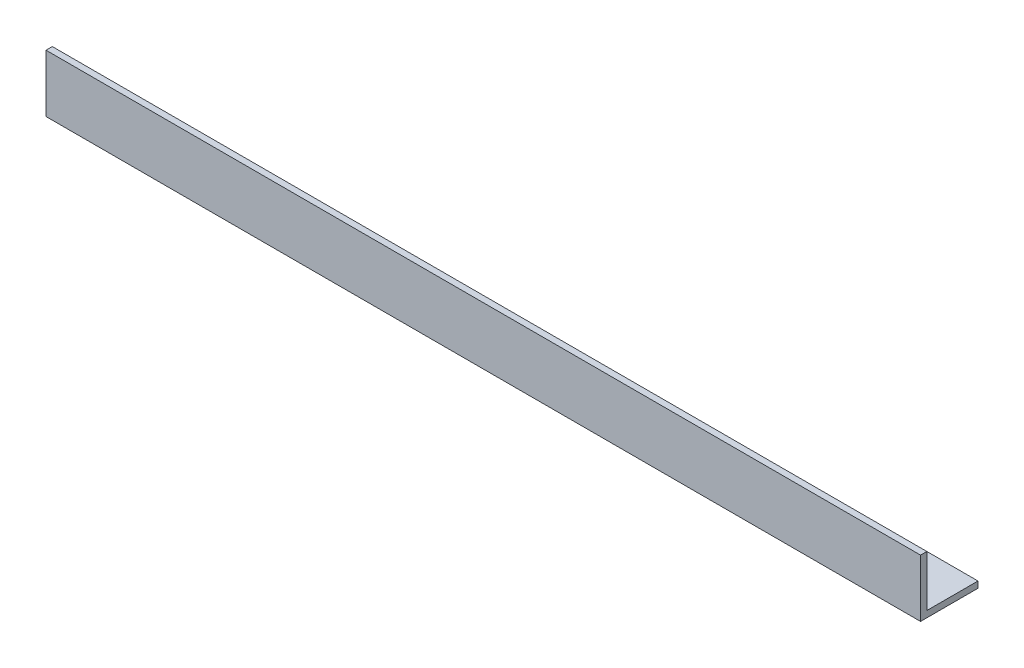
ISO-10303-21;
HEADER;
FILE_DESCRIPTION(('STEP AP214'),'2;1');
FILE_NAME('part.step','',(''),(''),'','','');
FILE_SCHEMA(('AUTOMOTIVE_DESIGN { 1 0 10303 214 1 1 1 1 }'));
ENDSEC;
DATA;
#1=APPLICATION_CONTEXT('core data for automotive mechanical design processes');
#2=APPLICATION_PROTOCOL_DEFINITION('international standard','automotive_design',2000,#1);
#3=PRODUCT_CONTEXT('',#1,'mechanical');
#4=PRODUCT('Part','Part','',(#3));
#5=PRODUCT_RELATED_PRODUCT_CATEGORY('part','',(#4));
#6=PRODUCT_DEFINITION_FORMATION('','',#4);
#7=PRODUCT_DEFINITION_CONTEXT('part definition',#1,'design');
#8=PRODUCT_DEFINITION('design','',#6,#7);
#9=PRODUCT_DEFINITION_SHAPE('','',#8);
#10=(LENGTH_UNIT() NAMED_UNIT(*) SI_UNIT(.MILLI.,.METRE.));
#11=(NAMED_UNIT(*) PLANE_ANGLE_UNIT() SI_UNIT($,.RADIAN.));
#12=(NAMED_UNIT(*) SI_UNIT($,.STERADIAN.) SOLID_ANGLE_UNIT());
#13=UNCERTAINTY_MEASURE_WITH_UNIT(LENGTH_MEASURE(1.E-05),#10,'distance_accuracy_value','');
#14=(GEOMETRIC_REPRESENTATION_CONTEXT(3) GLOBAL_UNCERTAINTY_ASSIGNED_CONTEXT((#13)) GLOBAL_UNIT_ASSIGNED_CONTEXT((#10,
#11,#12)) REPRESENTATION_CONTEXT('',''));
#15=CARTESIAN_POINT('',(0.,0.,0.));
#16=DIRECTION('',(0.,0.,1.));
#17=DIRECTION('',(1.,0.,0.));
#18=AXIS2_PLACEMENT_3D('',#15,#16,#17);
#19=CARTESIAN_POINT('',(193.294,2.794,0.));
#20=DIRECTION('',(1.,0.,0.));
#21=DIRECTION('',(0.,0.,-1.));
#22=AXIS2_PLACEMENT_3D('',#19,#20,#21);
#23=PLANE('',#22);
#24=DIRECTION('',(0.,0.,1.));
#25=VECTOR('',#24,1.);
#26=CARTESIAN_POINT('',(193.294,0.,0.));
#27=LINE('',#26,#25);
#28=CARTESIAN_POINT('',(193.294,0.,-12.7));
#29=VERTEX_POINT('',#28);
#30=CARTESIAN_POINT('',(193.294,0.,12.7));
#31=VERTEX_POINT('',#30);
#32=EDGE_CURVE('E78',#29,#31,#27,.T.);
#33=ORIENTED_EDGE('',*,*,#32,.F.);
#34=DIRECTION('',(0.,-1.,0.));
#35=VECTOR('',#34,1.);
#36=CARTESIAN_POINT('',(193.294,2.794,-12.7));
#37=LINE('',#36,#35);
#38=CARTESIAN_POINT('',(193.294,2.794,-12.7));
#39=VERTEX_POINT('',#38);
#40=EDGE_CURVE('E11',#39,#29,#37,.T.);
#41=ORIENTED_EDGE('',*,*,#40,.F.);
#42=DIRECTION('',(0.,0.,1.));
#43=VECTOR('',#42,1.);
#44=CARTESIAN_POINT('',(193.294,2.794,0.));
#45=LINE('',#44,#43);
#46=CARTESIAN_POINT('',(193.294,2.794,9.906));
#47=VERTEX_POINT('',#46);
#48=EDGE_CURVE('E97',#39,#47,#45,.T.);
#49=ORIENTED_EDGE('',*,*,#48,.T.);
#50=DIRECTION('',(0.,-1.,0.));
#51=VECTOR('',#50,1.);
#52=CARTESIAN_POINT('',(193.294,25.4,9.906));
#53=LINE('',#52,#51);
#54=CARTESIAN_POINT('',(193.294,25.4,9.906));
#55=VERTEX_POINT('',#54);
#56=EDGE_CURVE('E102',#55,#47,#53,.T.);
#57=ORIENTED_EDGE('',*,*,#56,.F.);
#58=DIRECTION('',(0.,0.,-1.));
#59=VECTOR('',#58,1.);
#60=CARTESIAN_POINT('',(193.294,25.4,12.7));
#61=LINE('',#60,#59);
#62=CARTESIAN_POINT('',(193.294,25.4,12.7));
#63=VERTEX_POINT('',#62);
#64=EDGE_CURVE('E83',#63,#55,#61,.T.);
#65=ORIENTED_EDGE('',*,*,#64,.F.);
#66=DIRECTION('',(0.,-1.,0.));
#67=VECTOR('',#66,1.);
#68=CARTESIAN_POINT('',(193.294,2.794,12.7));
#69=LINE('',#68,#67);
#70=EDGE_CURVE('E75',#63,#31,#69,.T.);
#71=ORIENTED_EDGE('',*,*,#70,.T.);
#72=EDGE_LOOP('',(#33,#41,#49,#57,#65,#71));
#73=FACE_BOUND('',#72,.T.);
#74=ADVANCED_FACE('F34',(#73),#23,.T.);
#75=CARTESIAN_POINT('',(0.,2.794,-12.7));
#76=DIRECTION('',(0.,0.,-1.));
#77=DIRECTION('',(-1.,0.,0.));
#78=AXIS2_PLACEMENT_3D('',#75,#76,#77);
#79=PLANE('',#78);
#80=DIRECTION('',(1.,0.,0.));
#81=VECTOR('',#80,1.);
#82=CARTESIAN_POINT('',(0.,0.,-12.7));
#83=LINE('',#82,#81);
#84=CARTESIAN_POINT('',(-193.294,0.,-12.7));
#85=VERTEX_POINT('',#84);
#86=EDGE_CURVE('E101',#85,#29,#83,.T.);
#87=ORIENTED_EDGE('',*,*,#86,.F.);
#88=DIRECTION('',(0.,-1.,0.));
#89=VECTOR('',#88,1.);
#90=CARTESIAN_POINT('',(-193.294,2.794,-12.7));
#91=LINE('',#90,#89);
#92=CARTESIAN_POINT('',(-193.294,2.794,-12.7));
#93=VERTEX_POINT('',#92);
#94=EDGE_CURVE('E41',#93,#85,#91,.T.);
#95=ORIENTED_EDGE('',*,*,#94,.F.);
#96=DIRECTION('',(1.,0.,0.));
#97=VECTOR('',#96,1.);
#98=CARTESIAN_POINT('',(0.,2.794,-12.7));
#99=LINE('',#98,#97);
#100=EDGE_CURVE('E117',#93,#39,#99,.T.);
#101=ORIENTED_EDGE('',*,*,#100,.T.);
#102=ORIENTED_EDGE('',*,*,#40,.T.);
#103=EDGE_LOOP('',(#87,#95,#101,#102));
#104=FACE_BOUND('',#103,.T.);
#105=ADVANCED_FACE('F116',(#104),#79,.T.);
#106=CARTESIAN_POINT('',(-193.294,2.794,0.));
#107=DIRECTION('',(1.,0.,0.));
#108=DIRECTION('',(0.,0.,-1.));
#109=AXIS2_PLACEMENT_3D('',#106,#107,#108);
#110=PLANE('',#109);
#111=DIRECTION('',(0.,0.,1.));
#112=VECTOR('',#111,1.);
#113=CARTESIAN_POINT('',(-193.294,0.,0.));
#114=LINE('',#113,#112);
#115=CARTESIAN_POINT('',(-193.294,0.,12.7));
#116=VERTEX_POINT('',#115);
#117=EDGE_CURVE('E98',#85,#116,#114,.T.);
#118=ORIENTED_EDGE('',*,*,#117,.T.);
#119=DIRECTION('',(0.,-1.,0.));
#120=VECTOR('',#119,1.);
#121=CARTESIAN_POINT('',(-193.294,2.794,12.7));
#122=LINE('',#121,#120);
#123=CARTESIAN_POINT('',(-193.294,25.4,12.7));
#124=VERTEX_POINT('',#123);
#125=EDGE_CURVE('E87',#124,#116,#122,.T.);
#126=ORIENTED_EDGE('',*,*,#125,.F.);
#127=DIRECTION('',(0.,0.,1.));
#128=VECTOR('',#127,1.);
#129=CARTESIAN_POINT('',(-193.294,25.4,12.7));
#130=LINE('',#129,#128);
#131=CARTESIAN_POINT('',(-193.294,25.4,9.906));
#132=VERTEX_POINT('',#131);
#133=EDGE_CURVE('E124',#132,#124,#130,.T.);
#134=ORIENTED_EDGE('',*,*,#133,.F.);
#135=DIRECTION('',(0.,-1.,0.));
#136=VECTOR('',#135,1.);
#137=CARTESIAN_POINT('',(-193.294,25.4,9.906));
#138=LINE('',#137,#136);
#139=CARTESIAN_POINT('',(-193.294,2.794,9.906));
#140=VERTEX_POINT('',#139);
#141=EDGE_CURVE('E106',#132,#140,#138,.T.);
#142=ORIENTED_EDGE('',*,*,#141,.T.);
#143=DIRECTION('',(0.,0.,1.));
#144=VECTOR('',#143,1.);
#145=CARTESIAN_POINT('',(-193.294,2.794,0.));
#146=LINE('',#145,#144);
#147=EDGE_CURVE('E88',#93,#140,#146,.T.);
#148=ORIENTED_EDGE('',*,*,#147,.F.);
#149=ORIENTED_EDGE('',*,*,#94,.T.);
#150=EDGE_LOOP('',(#118,#126,#134,#142,#148,#149));
#151=FACE_BOUND('',#150,.T.);
#152=ADVANCED_FACE('F113',(#151),#110,.F.);
#153=CARTESIAN_POINT('',(0.,2.794,12.7));
#154=DIRECTION('',(0.,0.,-1.));
#155=DIRECTION('',(-1.,0.,0.));
#156=AXIS2_PLACEMENT_3D('',#153,#154,#155);
#157=PLANE('',#156);
#158=DIRECTION('',(1.,0.,0.));
#159=VECTOR('',#158,1.);
#160=CARTESIAN_POINT('',(0.,0.,12.7));
#161=LINE('',#160,#159);
#162=EDGE_CURVE('E92',#116,#31,#161,.T.);
#163=ORIENTED_EDGE('',*,*,#162,.T.);
#164=ORIENTED_EDGE('',*,*,#70,.F.);
#165=DIRECTION('',(1.,0.,0.));
#166=VECTOR('',#165,1.);
#167=CARTESIAN_POINT('',(-193.294,25.4,12.7));
#168=LINE('',#167,#166);
#169=EDGE_CURVE('E128',#124,#63,#168,.T.);
#170=ORIENTED_EDGE('',*,*,#169,.F.);
#171=ORIENTED_EDGE('',*,*,#125,.T.);
#172=EDGE_LOOP('',(#163,#164,#170,#171));
#173=FACE_BOUND('',#172,.T.);
#174=ADVANCED_FACE('F93',(#173),#157,.F.);
#175=CARTESIAN_POINT('',(0.,2.794,0.));
#176=DIRECTION('',(0.,1.,0.));
#177=DIRECTION('',(0.,0.,1.));
#178=AXIS2_PLACEMENT_3D('',#175,#176,#177);
#179=PLANE('',#178);
#180=DIRECTION('',(-1.,0.,0.));
#181=VECTOR('',#180,1.);
#182=CARTESIAN_POINT('',(-193.294,2.794,9.906));
#183=LINE('',#182,#181);
#184=EDGE_CURVE('E48',#47,#140,#183,.T.);
#185=ORIENTED_EDGE('',*,*,#184,.F.);
#186=ORIENTED_EDGE('',*,*,#48,.F.);
#187=ORIENTED_EDGE('',*,*,#100,.F.);
#188=ORIENTED_EDGE('',*,*,#147,.T.);
#189=EDGE_LOOP('',(#185,#186,#187,#188));
#190=FACE_BOUND('',#189,.T.);
#191=ADVANCED_FACE('F118',(#190),#179,.T.);
#192=CARTESIAN_POINT('',(0.,0.,0.));
#193=DIRECTION('',(0.,1.,0.));
#194=DIRECTION('',(0.,0.,1.));
#195=AXIS2_PLACEMENT_3D('',#192,#193,#194);
#196=PLANE('',#195);
#197=ORIENTED_EDGE('',*,*,#32,.T.);
#198=ORIENTED_EDGE('',*,*,#162,.F.);
#199=ORIENTED_EDGE('',*,*,#117,.F.);
#200=ORIENTED_EDGE('',*,*,#86,.T.);
#201=EDGE_LOOP('',(#197,#198,#199,#200));
#202=FACE_BOUND('',#201,.T.);
#203=ADVANCED_FACE('F100',(#202),#196,.F.);
#204=CARTESIAN_POINT('',(-193.294,25.4,9.906));
#205=DIRECTION('',(0.,0.,1.));
#206=DIRECTION('',(1.,0.,0.));
#207=AXIS2_PLACEMENT_3D('',#204,#205,#206);
#208=PLANE('',#207);
#209=ORIENTED_EDGE('',*,*,#184,.T.);
#210=ORIENTED_EDGE('',*,*,#141,.F.);
#211=DIRECTION('',(-1.,0.,0.));
#212=VECTOR('',#211,1.);
#213=CARTESIAN_POINT('',(-193.294,25.4,9.906));
#214=LINE('',#213,#212);
#215=EDGE_CURVE('E122',#55,#132,#214,.T.);
#216=ORIENTED_EDGE('',*,*,#215,.F.);
#217=ORIENTED_EDGE('',*,*,#56,.T.);
#218=EDGE_LOOP('',(#209,#210,#216,#217));
#219=FACE_BOUND('',#218,.T.);
#220=ADVANCED_FACE('F144',(#219),#208,.F.);
#221=CARTESIAN_POINT('',(0.,25.4,0.));
#222=DIRECTION('',(0.,-1.,0.));
#223=DIRECTION('',(0.,0.,-1.));
#224=AXIS2_PLACEMENT_3D('',#221,#222,#223);
#225=PLANE('',#224);
#226=ORIENTED_EDGE('',*,*,#133,.T.);
#227=ORIENTED_EDGE('',*,*,#169,.T.);
#228=ORIENTED_EDGE('',*,*,#64,.T.);
#229=ORIENTED_EDGE('',*,*,#215,.T.);
#230=EDGE_LOOP('',(#226,#227,#228,#229));
#231=FACE_BOUND('',#230,.T.);
#232=ADVANCED_FACE('F134',(#231),#225,.F.);
#233=CLOSED_SHELL('',(#74,#105,#152,#174,#191,#203,#220,#232));
#234=MANIFOLD_SOLID_BREP('B2',#233);
#235=ADVANCED_BREP_SHAPE_REPRESENTATION('',(#18,#234),#14);
#236=SHAPE_DEFINITION_REPRESENTATION(#9,#235);
ENDSEC;
END-ISO-10303-21;
